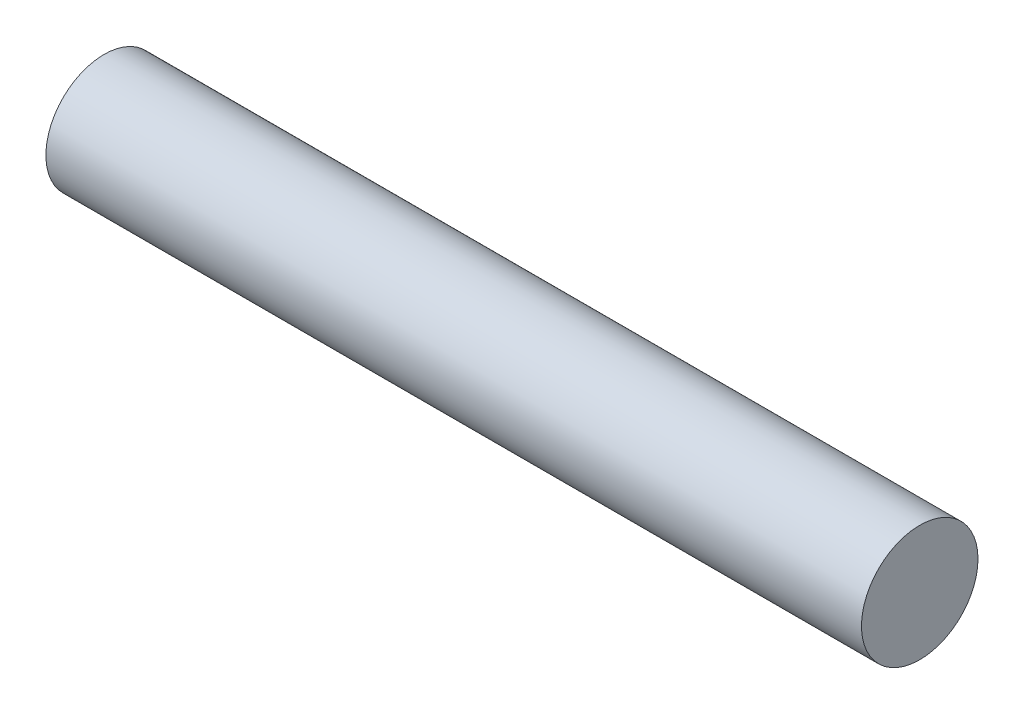
ISO-10303-21;
HEADER;
FILE_DESCRIPTION(('STEP AP214'),'2;1');
FILE_NAME('part.step','',(''),(''),'','','');
FILE_SCHEMA(('AUTOMOTIVE_DESIGN { 1 0 10303 214 1 1 1 1 }'));
ENDSEC;
DATA;
#1=APPLICATION_CONTEXT('core data for automotive mechanical design processes');
#2=APPLICATION_PROTOCOL_DEFINITION('international standard','automotive_design',2000,#1);
#3=PRODUCT_CONTEXT('',#1,'mechanical');
#4=PRODUCT('Part','Part','',(#3));
#5=PRODUCT_RELATED_PRODUCT_CATEGORY('part','',(#4));
#6=PRODUCT_DEFINITION_FORMATION('','',#4);
#7=PRODUCT_DEFINITION_CONTEXT('part definition',#1,'design');
#8=PRODUCT_DEFINITION('design','',#6,#7);
#9=PRODUCT_DEFINITION_SHAPE('','',#8);
#10=(LENGTH_UNIT() NAMED_UNIT(*) SI_UNIT(.MILLI.,.METRE.));
#11=(NAMED_UNIT(*) PLANE_ANGLE_UNIT() SI_UNIT($,.RADIAN.));
#12=(NAMED_UNIT(*) SI_UNIT($,.STERADIAN.) SOLID_ANGLE_UNIT());
#13=UNCERTAINTY_MEASURE_WITH_UNIT(LENGTH_MEASURE(1.E-05),#10,'distance_accuracy_value','');
#14=(GEOMETRIC_REPRESENTATION_CONTEXT(3) GLOBAL_UNCERTAINTY_ASSIGNED_CONTEXT((#13)) GLOBAL_UNIT_ASSIGNED_CONTEXT((#10,
#11,#12)) REPRESENTATION_CONTEXT('',''));
#15=CARTESIAN_POINT('',(0.,0.,0.));
#16=DIRECTION('',(0.,0.,1.));
#17=DIRECTION('',(1.,0.,0.));
#18=AXIS2_PLACEMENT_3D('',#15,#16,#17);
#19=CARTESIAN_POINT('',(14.,0.,0.));
#20=DIRECTION('',(-1.,0.,0.));
#21=DIRECTION('',(0.,0.,1.));
#22=AXIS2_PLACEMENT_3D('',#19,#20,#21);
#23=CYLINDRICAL_SURFACE('',#22,1.);
#24=CARTESIAN_POINT('',(14.,0.,0.));
#25=DIRECTION('',(1.,0.,0.));
#26=DIRECTION('',(0.,0.,-1.));
#27=AXIS2_PLACEMENT_3D('',#24,#25,#26);
#28=CIRCLE('',#27,1.);
#29=CARTESIAN_POINT('',(14.,0.,-1.));
#30=VERTEX_POINT('',#29);
#31=EDGE_CURVE('E10',#30,#30,#28,.T.);
#32=ORIENTED_EDGE('',*,*,#31,.F.);
#33=EDGE_LOOP('',(#32));
#34=FACE_BOUND('',#33,.T.);
#35=CARTESIAN_POINT('',(0.,0.,0.));
#36=DIRECTION('',(1.,0.,0.));
#37=DIRECTION('',(0.,0.,-1.));
#38=AXIS2_PLACEMENT_3D('',#35,#36,#37);
#39=CIRCLE('',#38,1.);
#40=CARTESIAN_POINT('',(0.,0.,-1.));
#41=VERTEX_POINT('',#40);
#42=EDGE_CURVE('E38',#41,#41,#39,.T.);
#43=ORIENTED_EDGE('',*,*,#42,.T.);
#44=EDGE_LOOP('',(#43));
#45=FACE_BOUND('',#44,.T.);
#46=ADVANCED_FACE('F35',(#34,#45),#23,.T.);
#47=CARTESIAN_POINT('',(14.,0.,0.));
#48=DIRECTION('',(1.,0.,0.));
#49=DIRECTION('',(0.,0.,-1.));
#50=AXIS2_PLACEMENT_3D('',#47,#48,#49);
#51=PLANE('',#50);
#52=ORIENTED_EDGE('',*,*,#31,.T.);
#53=EDGE_LOOP('',(#52));
#54=FACE_BOUND('',#53,.T.);
#55=ADVANCED_FACE('F50',(#54),#51,.T.);
#56=CARTESIAN_POINT('',(0.,0.,0.));
#57=DIRECTION('',(1.,0.,0.));
#58=DIRECTION('',(0.,0.,-1.));
#59=AXIS2_PLACEMENT_3D('',#56,#57,#58);
#60=PLANE('',#59);
#61=ORIENTED_EDGE('',*,*,#42,.F.);
#62=EDGE_LOOP('',(#61));
#63=FACE_BOUND('',#62,.T.);
#64=ADVANCED_FACE('F48',(#63),#60,.F.);
#65=CLOSED_SHELL('',(#46,#55,#64));
#66=MANIFOLD_SOLID_BREP('B2',#65);
#67=ADVANCED_BREP_SHAPE_REPRESENTATION('',(#18,#66),#14);
#68=SHAPE_DEFINITION_REPRESENTATION(#9,#67);
ENDSEC;
END-ISO-10303-21;
